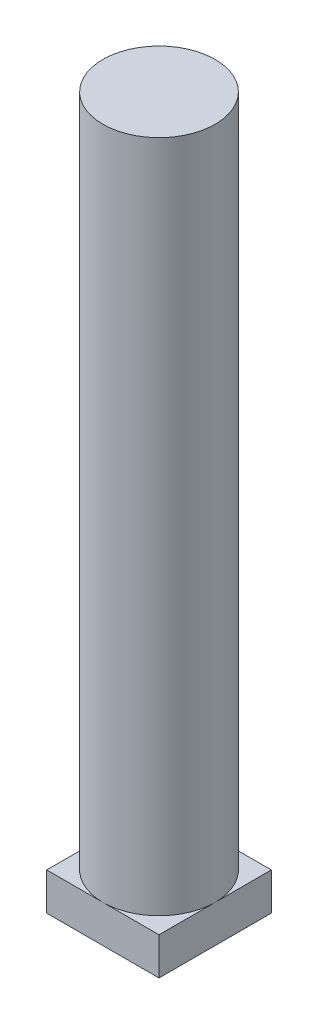
ISO-10303-21;
HEADER;
FILE_DESCRIPTION(('STEP AP214'),'2;1');
FILE_NAME('part.step','',(''),(''),'','','');
FILE_SCHEMA(('AUTOMOTIVE_DESIGN { 1 0 10303 214 1 1 1 1 }'));
ENDSEC;
DATA;
#1=APPLICATION_CONTEXT('core data for automotive mechanical design processes');
#2=APPLICATION_PROTOCOL_DEFINITION('international standard','automotive_design',2000,#1);
#3=PRODUCT_CONTEXT('',#1,'mechanical');
#4=PRODUCT('Part','Part','',(#3));
#5=PRODUCT_RELATED_PRODUCT_CATEGORY('part','',(#4));
#6=PRODUCT_DEFINITION_FORMATION('','',#4);
#7=PRODUCT_DEFINITION_CONTEXT('part definition',#1,'design');
#8=PRODUCT_DEFINITION('design','',#6,#7);
#9=PRODUCT_DEFINITION_SHAPE('','',#8);
#10=(LENGTH_UNIT() NAMED_UNIT(*) SI_UNIT(.MILLI.,.METRE.));
#11=(NAMED_UNIT(*) PLANE_ANGLE_UNIT() SI_UNIT($,.RADIAN.));
#12=(NAMED_UNIT(*) SI_UNIT($,.STERADIAN.) SOLID_ANGLE_UNIT());
#13=UNCERTAINTY_MEASURE_WITH_UNIT(LENGTH_MEASURE(1.E-05),#10,'distance_accuracy_value','');
#14=(GEOMETRIC_REPRESENTATION_CONTEXT(3) GLOBAL_UNCERTAINTY_ASSIGNED_CONTEXT((#13)) GLOBAL_UNIT_ASSIGNED_CONTEXT((#10,
#11,#12)) REPRESENTATION_CONTEXT('',''));
#15=CARTESIAN_POINT('',(0.,0.,0.));
#16=DIRECTION('',(0.,0.,1.));
#17=DIRECTION('',(1.,0.,0.));
#18=AXIS2_PLACEMENT_3D('',#15,#16,#17);
#19=CARTESIAN_POINT('',(0.,10.,0.));
#20=DIRECTION('',(0.,1.,0.));
#21=DIRECTION('',(0.,0.,1.));
#22=AXIS2_PLACEMENT_3D('',#19,#20,#21);
#23=PLANE('',#22);
#24=CARTESIAN_POINT('',(15.,10.,15.));
#25=DIRECTION('',(0.,1.,0.));
#26=DIRECTION('',(0.,0.,1.));
#27=AXIS2_PLACEMENT_3D('',#24,#25,#26);
#28=CIRCLE('',#27,15.);
#29=CARTESIAN_POINT('',(15.,10.,30.));
#30=VERTEX_POINT('',#29);
#31=CARTESIAN_POINT('',(30.,10.,15.));
#32=VERTEX_POINT('',#31);
#33=EDGE_CURVE('E50',#30,#32,#28,.T.);
#34=ORIENTED_EDGE('',*,*,#33,.F.);
#35=DIRECTION('',(1.,0.,0.));
#36=VECTOR('',#35,1.);
#37=CARTESIAN_POINT('',(0.,10.,30.));
#38=LINE('',#37,#36);
#39=CARTESIAN_POINT('',(30.,10.,30.));
#40=VERTEX_POINT('',#39);
#41=EDGE_CURVE('E104',#30,#40,#38,.T.);
#42=ORIENTED_EDGE('',*,*,#41,.T.);
#43=DIRECTION('',(0.,0.,-1.));
#44=VECTOR('',#43,1.);
#45=CARTESIAN_POINT('',(30.,10.,0.));
#46=LINE('',#45,#44);
#47=EDGE_CURVE('E116',#40,#32,#46,.T.);
#48=ORIENTED_EDGE('',*,*,#47,.T.);
#49=EDGE_LOOP('',(#34,#42,#48));
#50=FACE_BOUND('',#49,.T.);
#51=ADVANCED_FACE('F39',(#50),#23,.T.);
#52=CARTESIAN_POINT('',(15.,10.,0.));
#53=VERTEX_POINT('',#52);
#54=EDGE_CURVE('E11',#32,#53,#28,.T.);
#55=ORIENTED_EDGE('',*,*,#54,.F.);
#56=CARTESIAN_POINT('',(30.,10.,0.));
#57=VERTEX_POINT('',#56);
#58=EDGE_CURVE('E103',#32,#57,#46,.T.);
#59=ORIENTED_EDGE('',*,*,#58,.T.);
#60=DIRECTION('',(-1.,0.,0.));
#61=VECTOR('',#60,1.);
#62=CARTESIAN_POINT('',(0.,10.,0.));
#63=LINE('',#62,#61);
#64=EDGE_CURVE('E125',#57,#53,#63,.T.);
#65=ORIENTED_EDGE('',*,*,#64,.T.);
#66=EDGE_LOOP('',(#55,#59,#65));
#67=FACE_BOUND('',#66,.T.);
#68=ADVANCED_FACE('F156',(#67),#23,.T.);
#69=CARTESIAN_POINT('',(0.,10.,15.));
#70=VERTEX_POINT('',#69);
#71=EDGE_CURVE('E48',#53,#70,#28,.T.);
#72=ORIENTED_EDGE('',*,*,#71,.F.);
#73=CARTESIAN_POINT('',(0.,10.,0.));
#74=VERTEX_POINT('',#73);
#75=EDGE_CURVE('E124',#53,#74,#63,.T.);
#76=ORIENTED_EDGE('',*,*,#75,.T.);
#77=DIRECTION('',(0.,0.,1.));
#78=VECTOR('',#77,1.);
#79=CARTESIAN_POINT('',(0.,10.,0.));
#80=LINE('',#79,#78);
#81=EDGE_CURVE('E114',#74,#70,#80,.T.);
#82=ORIENTED_EDGE('',*,*,#81,.T.);
#83=EDGE_LOOP('',(#72,#76,#82));
#84=FACE_BOUND('',#83,.T.);
#85=ADVANCED_FACE('F155',(#84),#23,.T.);
#86=CARTESIAN_POINT('',(0.,10.,0.));
#87=DIRECTION('',(1.,0.,0.));
#88=DIRECTION('',(0.,0.,-1.));
#89=AXIS2_PLACEMENT_3D('',#86,#87,#88);
#90=PLANE('',#89);
#91=DIRECTION('',(0.,0.,1.));
#92=VECTOR('',#91,1.);
#93=CARTESIAN_POINT('',(0.,0.,0.));
#94=LINE('',#93,#92);
#95=CARTESIAN_POINT('',(0.,0.,0.));
#96=VERTEX_POINT('',#95);
#97=CARTESIAN_POINT('',(0.,0.,30.));
#98=VERTEX_POINT('',#97);
#99=EDGE_CURVE('E128',#96,#98,#94,.T.);
#100=ORIENTED_EDGE('',*,*,#99,.T.);
#101=DIRECTION('',(0.,-1.,0.));
#102=VECTOR('',#101,1.);
#103=CARTESIAN_POINT('',(0.,10.,30.));
#104=LINE('',#103,#102);
#105=CARTESIAN_POINT('',(0.,10.,30.));
#106=VERTEX_POINT('',#105);
#107=EDGE_CURVE('E43',#106,#98,#104,.T.);
#108=ORIENTED_EDGE('',*,*,#107,.F.);
#109=EDGE_CURVE('E99',#70,#106,#80,.T.);
#110=ORIENTED_EDGE('',*,*,#109,.F.);
#111=ORIENTED_EDGE('',*,*,#81,.F.);
#112=DIRECTION('',(0.,-1.,0.));
#113=VECTOR('',#112,1.);
#114=CARTESIAN_POINT('',(0.,10.,0.));
#115=LINE('',#114,#113);
#116=EDGE_CURVE('E127',#74,#96,#115,.T.);
#117=ORIENTED_EDGE('',*,*,#116,.T.);
#118=EDGE_LOOP('',(#100,#108,#110,#111,#117));
#119=FACE_BOUND('',#118,.T.);
#120=ADVANCED_FACE('F41',(#119),#90,.F.);
#121=CARTESIAN_POINT('',(0.,10.,30.));
#122=DIRECTION('',(0.,0.,-1.));
#123=DIRECTION('',(-1.,0.,0.));
#124=AXIS2_PLACEMENT_3D('',#121,#122,#123);
#125=PLANE('',#124);
#126=DIRECTION('',(1.,0.,0.));
#127=VECTOR('',#126,1.);
#128=CARTESIAN_POINT('',(0.,0.,30.));
#129=LINE('',#128,#127);
#130=CARTESIAN_POINT('',(30.,0.,30.));
#131=VERTEX_POINT('',#130);
#132=EDGE_CURVE('E131',#98,#131,#129,.T.);
#133=ORIENTED_EDGE('',*,*,#132,.T.);
#134=DIRECTION('',(0.,-1.,0.));
#135=VECTOR('',#134,1.);
#136=CARTESIAN_POINT('',(30.,10.,30.));
#137=LINE('',#136,#135);
#138=EDGE_CURVE('E110',#40,#131,#137,.T.);
#139=ORIENTED_EDGE('',*,*,#138,.F.);
#140=ORIENTED_EDGE('',*,*,#41,.F.);
#141=EDGE_CURVE('E93',#106,#30,#38,.T.);
#142=ORIENTED_EDGE('',*,*,#141,.F.);
#143=ORIENTED_EDGE('',*,*,#107,.T.);
#144=EDGE_LOOP('',(#133,#139,#140,#142,#143));
#145=FACE_BOUND('',#144,.T.);
#146=ADVANCED_FACE('F108',(#145),#125,.F.);
#147=CARTESIAN_POINT('',(30.,10.,0.));
#148=DIRECTION('',(-1.,0.,0.));
#149=DIRECTION('',(0.,0.,1.));
#150=AXIS2_PLACEMENT_3D('',#147,#148,#149);
#151=PLANE('',#150);
#152=DIRECTION('',(0.,0.,-1.));
#153=VECTOR('',#152,1.);
#154=CARTESIAN_POINT('',(30.,0.,0.));
#155=LINE('',#154,#153);
#156=CARTESIAN_POINT('',(30.,0.,0.));
#157=VERTEX_POINT('',#156);
#158=EDGE_CURVE('E133',#131,#157,#155,.T.);
#159=ORIENTED_EDGE('',*,*,#158,.T.);
#160=DIRECTION('',(0.,-1.,0.));
#161=VECTOR('',#160,1.);
#162=CARTESIAN_POINT('',(30.,10.,0.));
#163=LINE('',#162,#161);
#164=EDGE_CURVE('E139',#57,#157,#163,.T.);
#165=ORIENTED_EDGE('',*,*,#164,.F.);
#166=ORIENTED_EDGE('',*,*,#58,.F.);
#167=ORIENTED_EDGE('',*,*,#47,.F.);
#168=ORIENTED_EDGE('',*,*,#138,.T.);
#169=EDGE_LOOP('',(#159,#165,#166,#167,#168));
#170=FACE_BOUND('',#169,.T.);
#171=ADVANCED_FACE('F143',(#170),#151,.F.);
#172=CARTESIAN_POINT('',(0.,10.,0.));
#173=DIRECTION('',(0.,0.,1.));
#174=DIRECTION('',(1.,0.,0.));
#175=AXIS2_PLACEMENT_3D('',#172,#173,#174);
#176=PLANE('',#175);
#177=DIRECTION('',(-1.,0.,0.));
#178=VECTOR('',#177,1.);
#179=CARTESIAN_POINT('',(0.,0.,0.));
#180=LINE('',#179,#178);
#181=EDGE_CURVE('E135',#157,#96,#180,.T.);
#182=ORIENTED_EDGE('',*,*,#181,.T.);
#183=ORIENTED_EDGE('',*,*,#116,.F.);
#184=ORIENTED_EDGE('',*,*,#75,.F.);
#185=ORIENTED_EDGE('',*,*,#64,.F.);
#186=ORIENTED_EDGE('',*,*,#164,.T.);
#187=EDGE_LOOP('',(#182,#183,#184,#185,#186));
#188=FACE_BOUND('',#187,.T.);
#189=ADVANCED_FACE('F151',(#188),#176,.F.);
#190=EDGE_CURVE('E97',#70,#30,#28,.T.);
#191=ORIENTED_EDGE('',*,*,#190,.F.);
#192=ORIENTED_EDGE('',*,*,#109,.T.);
#193=ORIENTED_EDGE('',*,*,#141,.T.);
#194=EDGE_LOOP('',(#191,#192,#193));
#195=FACE_BOUND('',#194,.T.);
#196=ADVANCED_FACE('F95',(#195),#23,.T.);
#197=CARTESIAN_POINT('',(0.,0.,0.));
#198=DIRECTION('',(0.,1.,0.));
#199=DIRECTION('',(0.,0.,1.));
#200=AXIS2_PLACEMENT_3D('',#197,#198,#199);
#201=PLANE('',#200);
#202=ORIENTED_EDGE('',*,*,#99,.F.);
#203=ORIENTED_EDGE('',*,*,#181,.F.);
#204=ORIENTED_EDGE('',*,*,#158,.F.);
#205=ORIENTED_EDGE('',*,*,#132,.F.);
#206=EDGE_LOOP('',(#202,#203,#204,#205));
#207=FACE_BOUND('',#206,.T.);
#208=ADVANCED_FACE('F148',(#207),#201,.F.);
#209=CARTESIAN_POINT('',(15.,190.,15.));
#210=DIRECTION('',(0.,-1.,0.));
#211=DIRECTION('',(0.,0.,-1.));
#212=AXIS2_PLACEMENT_3D('',#209,#210,#211);
#213=CYLINDRICAL_SURFACE('',#212,15.);
#214=CARTESIAN_POINT('',(15.,190.,15.));
#215=DIRECTION('',(0.,1.,0.));
#216=DIRECTION('',(0.,0.,1.));
#217=AXIS2_PLACEMENT_3D('',#214,#215,#216);
#218=CIRCLE('',#217,15.);
#219=CARTESIAN_POINT('',(15.,190.,30.));
#220=VERTEX_POINT('',#219);
#221=EDGE_CURVE('E118',#220,#220,#218,.T.);
#222=ORIENTED_EDGE('',*,*,#221,.F.);
#223=EDGE_LOOP('',(#222));
#224=FACE_BOUND('',#223,.T.);
#225=ORIENTED_EDGE('',*,*,#33,.T.);
#226=ORIENTED_EDGE('',*,*,#54,.T.);
#227=ORIENTED_EDGE('',*,*,#71,.T.);
#228=ORIENTED_EDGE('',*,*,#190,.T.);
#229=EDGE_LOOP('',(#225,#226,#227,#228));
#230=FACE_BOUND('',#229,.T.);
#231=ADVANCED_FACE('F119',(#224,#230),#213,.T.);
#232=CARTESIAN_POINT('',(15.,190.,15.));
#233=DIRECTION('',(0.,1.,0.));
#234=DIRECTION('',(0.,0.,1.));
#235=AXIS2_PLACEMENT_3D('',#232,#233,#234);
#236=PLANE('',#235);
#237=ORIENTED_EDGE('',*,*,#221,.T.);
#238=EDGE_LOOP('',(#237));
#239=FACE_BOUND('',#238,.T.);
#240=ADVANCED_FACE('F199',(#239),#236,.T.);
#241=CLOSED_SHELL('',(#51,#68,#85,#120,#146,#171,#189,#196,#208,#231,#240));
#242=MANIFOLD_SOLID_BREP('B2',#241);
#243=ADVANCED_BREP_SHAPE_REPRESENTATION('',(#18,#242),#14);
#244=SHAPE_DEFINITION_REPRESENTATION(#9,#243);
ENDSEC;
END-ISO-10303-21;
